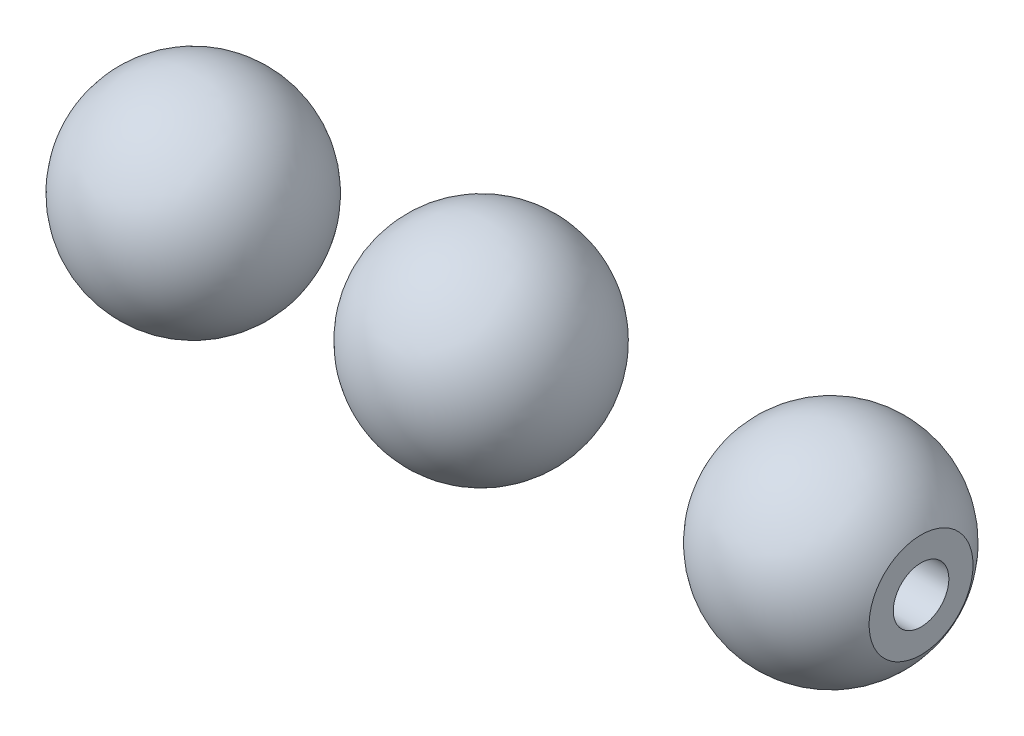
ISO-10303-21;
HEADER;
FILE_DESCRIPTION(('STEP AP214'),'2;1');
FILE_NAME('part.step','',(''),(''),'','','');
FILE_SCHEMA(('AUTOMOTIVE_DESIGN { 1 0 10303 214 1 1 1 1 }'));
ENDSEC;
DATA;
#1=APPLICATION_CONTEXT('core data for automotive mechanical design processes');
#2=APPLICATION_PROTOCOL_DEFINITION('international standard','automotive_design',2000,#1);
#3=PRODUCT_CONTEXT('',#1,'mechanical');
#4=PRODUCT('Part','Part','',(#3));
#5=PRODUCT_RELATED_PRODUCT_CATEGORY('part','',(#4));
#6=PRODUCT_DEFINITION_FORMATION('','',#4);
#7=PRODUCT_DEFINITION_CONTEXT('part definition',#1,'design');
#8=PRODUCT_DEFINITION('design','',#6,#7);
#9=PRODUCT_DEFINITION_SHAPE('','',#8);
#10=(LENGTH_UNIT() NAMED_UNIT(*) SI_UNIT(.MILLI.,.METRE.));
#11=(NAMED_UNIT(*) PLANE_ANGLE_UNIT() SI_UNIT($,.RADIAN.));
#12=(NAMED_UNIT(*) SI_UNIT($,.STERADIAN.) SOLID_ANGLE_UNIT());
#13=UNCERTAINTY_MEASURE_WITH_UNIT(LENGTH_MEASURE(1.E-05),#10,'distance_accuracy_value','');
#14=(GEOMETRIC_REPRESENTATION_CONTEXT(3) GLOBAL_UNCERTAINTY_ASSIGNED_CONTEXT((#13)) GLOBAL_UNIT_ASSIGNED_CONTEXT((#10,
#11,#12)) REPRESENTATION_CONTEXT('',''));
#15=CARTESIAN_POINT('',(0.,0.,0.));
#16=DIRECTION('',(0.,0.,1.));
#17=DIRECTION('',(1.,0.,0.));
#18=AXIS2_PLACEMENT_3D('',#15,#16,#17);
#19=CARTESIAN_POINT('',(95.0241035407147,0.,0.));
#20=DIRECTION('',(-1.,0.,0.));
#21=DIRECTION('',(0.,0.,1.));
#22=AXIS2_PLACEMENT_3D('',#19,#20,#21);
#23=PLANE('',#22);
#24=CARTESIAN_POINT('',(95.0241035407147,0.,0.));
#25=DIRECTION('',(1.,0.,0.));
#26=DIRECTION('',(0.,0.,-1.));
#27=AXIS2_PLACEMENT_3D('',#24,#25,#26);
#28=CIRCLE('',#27,6.);
#29=CARTESIAN_POINT('',(95.0241035407147,0.,-6.));
#30=VERTEX_POINT('',#29);
#31=EDGE_CURVE('E61',#30,#30,#28,.T.);
#32=ORIENTED_EDGE('',*,*,#31,.F.);
#33=EDGE_LOOP('',(#32));
#34=FACE_BOUND('',#33,.T.);
#35=CARTESIAN_POINT('',(95.0241035407147,0.,0.));
#36=DIRECTION('',(1.,0.,0.));
#37=DIRECTION('',(0.,0.,-1.));
#38=AXIS2_PLACEMENT_3D('',#35,#36,#37);
#39=CIRCLE('',#38,11.2249721603218);
#40=CARTESIAN_POINT('',(95.0241035407147,0.,-11.2249721603218));
#41=VERTEX_POINT('',#40);
#42=EDGE_CURVE('E12',#41,#41,#39,.T.);
#43=ORIENTED_EDGE('',*,*,#42,.T.);
#44=EDGE_LOOP('',(#43));
#45=FACE_BOUND('',#44,.T.);
#46=ADVANCED_FACE('F43',(#34,#45),#23,.F.);
#47=CARTESIAN_POINT('',(75.5241035407147,0.,0.));
#48=DIRECTION('',(1.,0.,0.));
#49=DIRECTION('',(0.,-1.,0.));
#50=AXIS2_PLACEMENT_3D('',#47,#48,#49);
#51=SPHERICAL_SURFACE('',#50,22.5);
#52=ORIENTED_EDGE('',*,*,#42,.F.);
#53=EDGE_LOOP('',(#52));
#54=FACE_BOUND('',#53,.T.);
#55=ADVANCED_FACE('F56',(#54),#51,.T.);
#56=CARTESIAN_POINT('',(61.0241035407147,0.,0.));
#57=DIRECTION('',(1.,0.,0.));
#58=DIRECTION('',(0.,0.,-1.));
#59=AXIS2_PLACEMENT_3D('',#56,#57,#58);
#60=CONICAL_SURFACE('',#59,5.99999999999999,1.02974425867665);
#61=CARTESIAN_POINT('',(57.4189398265493,0.,0.));
#62=VERTEX_POINT('',#61);
#63=VERTEX_LOOP('',#62);
#64=FACE_BOUND('',#63,.T.);
#65=CARTESIAN_POINT('',(61.0241035407147,0.,0.));
#66=DIRECTION('',(1.,0.,0.));
#67=DIRECTION('',(0.,0.,-1.));
#68=AXIS2_PLACEMENT_3D('',#65,#66,#67);
#69=CIRCLE('',#68,5.99999999999999);
#70=CARTESIAN_POINT('',(61.0241035407147,0.,-5.99999999999999));
#71=VERTEX_POINT('',#70);
#72=EDGE_CURVE('E49',#71,#71,#69,.T.);
#73=ORIENTED_EDGE('',*,*,#72,.T.);
#74=EDGE_LOOP('',(#73));
#75=FACE_BOUND('',#74,.T.);
#76=ADVANCED_FACE('F52',(#64,#75),#60,.F.);
#77=CARTESIAN_POINT('',(95.0241035407147,0.,0.));
#78=DIRECTION('',(1.,0.,0.));
#79=DIRECTION('',(0.,0.,-1.));
#80=AXIS2_PLACEMENT_3D('',#77,#78,#79);
#81=CYLINDRICAL_SURFACE('',#80,5.99999999999999);
#82=ORIENTED_EDGE('',*,*,#72,.F.);
#83=EDGE_LOOP('',(#82));
#84=FACE_BOUND('',#83,.T.);
#85=ORIENTED_EDGE('',*,*,#31,.T.);
#86=EDGE_LOOP('',(#85));
#87=FACE_BOUND('',#86,.T.);
#88=ADVANCED_FACE('F55',(#84,#87),#81,.F.);
#89=CLOSED_SHELL('',(#46,#55,#76,#88));
#90=MANIFOLD_SOLID_BREP('B2',#89);
#91=CARTESIAN_POINT('',(-81.6746595388299,7.73391560156635,0.));
#92=DIRECTION('',(1.,0.,0.));
#93=DIRECTION('',(0.,0.,-1.));
#94=AXIS2_PLACEMENT_3D('',#91,#92,#93);
#95=PLANE('',#94);
#96=CARTESIAN_POINT('',(-81.6746595388299,-3.49105655875548,0.));
#97=DIRECTION('',(-1.,0.,0.));
#98=DIRECTION('',(0.,0.,1.));
#99=AXIS2_PLACEMENT_3D('',#96,#97,#98);
#100=CIRCLE('',#99,10.);
#101=CARTESIAN_POINT('',(-81.6746595388299,-3.49105655875548,10.));
#102=VERTEX_POINT('',#101);
#103=EDGE_CURVE('E134',#102,#102,#100,.T.);
#104=ORIENTED_EDGE('',*,*,#103,.F.);
#105=EDGE_LOOP('',(#104));
#106=FACE_BOUND('',#105,.T.);
#107=CARTESIAN_POINT('',(-81.6746595388299,-3.49105655875548,0.));
#108=DIRECTION('',(-1.,0.,0.));
#109=DIRECTION('',(0.,0.,1.));
#110=AXIS2_PLACEMENT_3D('',#107,#108,#109);
#111=CIRCLE('',#110,11.2249721603218);
#112=CARTESIAN_POINT('',(-81.6746595388299,-3.49105655875548,11.2249721603218));
#113=VERTEX_POINT('',#112);
#114=EDGE_CURVE('E41',#113,#113,#111,.T.);
#115=ORIENTED_EDGE('',*,*,#114,.T.);
#116=EDGE_LOOP('',(#115));
#117=FACE_BOUND('',#116,.T.);
#118=ADVANCED_FACE('F109',(#106,#117),#95,.F.);
#119=CARTESIAN_POINT('',(-62.1746595388299,-3.49105655875548,0.));
#120=DIRECTION('',(-1.,0.,0.));
#121=DIRECTION('',(0.,1.,0.));
#122=AXIS2_PLACEMENT_3D('',#119,#120,#121);
#123=SPHERICAL_SURFACE('',#122,22.5);
#124=ORIENTED_EDGE('',*,*,#114,.F.);
#125=EDGE_LOOP('',(#124));
#126=FACE_BOUND('',#125,.T.);
#127=ADVANCED_FACE('F122',(#126),#123,.T.);
#128=CARTESIAN_POINT('',(-49.6746595388299,-3.49105655875548,0.));
#129=DIRECTION('',(-1.,0.,0.));
#130=DIRECTION('',(0.,0.,1.));
#131=AXIS2_PLACEMENT_3D('',#128,#129,#130);
#132=CONICAL_SURFACE('',#131,5.99999999999999,1.02974425867665);
#133=CARTESIAN_POINT('',(-46.0694958246645,-3.49105655875549,0.));
#134=VERTEX_POINT('',#133);
#135=VERTEX_LOOP('',#134);
#136=FACE_BOUND('',#135,.T.);
#137=CARTESIAN_POINT('',(-49.6746595388299,-3.49105655875548,0.));
#138=DIRECTION('',(-1.,0.,0.));
#139=DIRECTION('',(0.,0.,1.));
#140=AXIS2_PLACEMENT_3D('',#137,#138,#139);
#141=CIRCLE('',#140,5.99999999999999);
#142=CARTESIAN_POINT('',(-49.6746595388299,-3.49105655875548,5.99999999999999));
#143=VERTEX_POINT('',#142);
#144=EDGE_CURVE('E115',#143,#143,#141,.T.);
#145=ORIENTED_EDGE('',*,*,#144,.T.);
#146=EDGE_LOOP('',(#145));
#147=FACE_BOUND('',#146,.T.);
#148=ADVANCED_FACE('F118',(#136,#147),#132,.F.);
#149=CARTESIAN_POINT('',(-81.6746595388299,-3.49105655875548,0.));
#150=DIRECTION('',(-1.,0.,0.));
#151=DIRECTION('',(0.,0.,1.));
#152=AXIS2_PLACEMENT_3D('',#149,#150,#151);
#153=CYLINDRICAL_SURFACE('',#152,5.99999999999999);
#154=ORIENTED_EDGE('',*,*,#144,.F.);
#155=EDGE_LOOP('',(#154));
#156=FACE_BOUND('',#155,.T.);
#157=CARTESIAN_POINT('',(-73.6746595388299,-3.49105655875548,0.));
#158=DIRECTION('',(-1.,0.,0.));
#159=DIRECTION('',(0.,0.,1.));
#160=AXIS2_PLACEMENT_3D('',#157,#158,#159);
#161=CIRCLE('',#160,5.99999999999999);
#162=CARTESIAN_POINT('',(-73.6746595388299,-3.49105655875548,5.99999999999999));
#163=VERTEX_POINT('',#162);
#164=EDGE_CURVE('E127',#163,#163,#161,.T.);
#165=ORIENTED_EDGE('',*,*,#164,.T.);
#166=EDGE_LOOP('',(#165));
#167=FACE_BOUND('',#166,.T.);
#168=ADVANCED_FACE('F121',(#156,#167),#153,.F.);
#169=CARTESIAN_POINT('',(-73.6746595388299,2.50894344124451,0.));
#170=DIRECTION('',(1.,0.,0.));
#171=DIRECTION('',(0.,0.,-1.));
#172=AXIS2_PLACEMENT_3D('',#169,#170,#171);
#173=PLANE('',#172);
#174=ORIENTED_EDGE('',*,*,#164,.F.);
#175=EDGE_LOOP('',(#174));
#176=FACE_BOUND('',#175,.T.);
#177=CARTESIAN_POINT('',(-73.6746595388299,-3.49105655875548,0.));
#178=DIRECTION('',(-1.,0.,0.));
#179=DIRECTION('',(0.,0.,1.));
#180=AXIS2_PLACEMENT_3D('',#177,#178,#179);
#181=CIRCLE('',#180,10.);
#182=CARTESIAN_POINT('',(-73.6746595388299,-3.49105655875548,10.));
#183=VERTEX_POINT('',#182);
#184=EDGE_CURVE('E129',#183,#183,#181,.T.);
#185=ORIENTED_EDGE('',*,*,#184,.T.);
#186=EDGE_LOOP('',(#185));
#187=FACE_BOUND('',#186,.T.);
#188=ADVANCED_FACE('F151',(#176,#187),#173,.F.);
#189=CARTESIAN_POINT('',(-81.6746595388299,-3.49105655875548,0.));
#190=DIRECTION('',(-1.,0.,0.));
#191=DIRECTION('',(0.,0.,1.));
#192=AXIS2_PLACEMENT_3D('',#189,#190,#191);
#193=CYLINDRICAL_SURFACE('',#192,10.);
#194=ORIENTED_EDGE('',*,*,#184,.F.);
#195=EDGE_LOOP('',(#194));
#196=FACE_BOUND('',#195,.T.);
#197=ORIENTED_EDGE('',*,*,#103,.T.);
#198=EDGE_LOOP('',(#197));
#199=FACE_BOUND('',#198,.T.);
#200=ADVANCED_FACE('F138',(#196,#199),#193,.F.);
#201=CLOSED_SHELL('',(#118,#127,#148,#168,#188,#200));
#202=MANIFOLD_SOLID_BREP('B6',#201);
#203=CARTESIAN_POINT('',(0.,0.,-19.5));
#204=DIRECTION('',(0.,0.,1.));
#205=DIRECTION('',(1.,0.,0.));
#206=AXIS2_PLACEMENT_3D('',#203,#204,#205);
#207=PLANE('',#206);
#208=CARTESIAN_POINT('',(0.,0.,-19.5));
#209=DIRECTION('',(0.,0.,-1.));
#210=DIRECTION('',(-1.,0.,0.));
#211=AXIS2_PLACEMENT_3D('',#208,#209,#210);
#212=CIRCLE('',#211,10.);
#213=CARTESIAN_POINT('',(-10.,0.,-19.5));
#214=VERTEX_POINT('',#213);
#215=EDGE_CURVE('E216',#214,#214,#212,.T.);
#216=ORIENTED_EDGE('',*,*,#215,.F.);
#217=EDGE_LOOP('',(#216));
#218=FACE_BOUND('',#217,.T.);
#219=CARTESIAN_POINT('',(0.,0.,-19.5));
#220=DIRECTION('',(0.,0.,-1.));
#221=DIRECTION('',(-1.,0.,0.));
#222=AXIS2_PLACEMENT_3D('',#219,#220,#221);
#223=CIRCLE('',#222,11.2249721603218);
#224=CARTESIAN_POINT('',(-11.2249721603218,0.,-19.5));
#225=VERTEX_POINT('',#224);
#226=EDGE_CURVE('E107',#225,#225,#223,.T.);
#227=ORIENTED_EDGE('',*,*,#226,.T.);
#228=EDGE_LOOP('',(#227));
#229=FACE_BOUND('',#228,.T.);
#230=ADVANCED_FACE('F196',(#218,#229),#207,.F.);
#231=CARTESIAN_POINT('',(0.,0.,0.));
#232=DIRECTION('',(0.,0.,-1.));
#233=DIRECTION('',(0.,-1.,0.));
#234=AXIS2_PLACEMENT_3D('',#231,#232,#233);
#235=SPHERICAL_SURFACE('',#234,22.5);
#236=ORIENTED_EDGE('',*,*,#226,.F.);
#237=EDGE_LOOP('',(#236));
#238=FACE_BOUND('',#237,.T.);
#239=ADVANCED_FACE('F209',(#238),#235,.T.);
#240=CARTESIAN_POINT('',(0.,0.,14.5));
#241=DIRECTION('',(0.,0.,-1.));
#242=DIRECTION('',(-1.,0.,0.));
#243=AXIS2_PLACEMENT_3D('',#240,#241,#242);
#244=CONICAL_SURFACE('',#243,5.99999999999999,1.02974425867665);
#245=CARTESIAN_POINT('',(0.,0.,18.1051637141654));
#246=VERTEX_POINT('',#245);
#247=VERTEX_LOOP('',#246);
#248=FACE_BOUND('',#247,.T.);
#249=CARTESIAN_POINT('',(0.,0.,14.5));
#250=DIRECTION('',(0.,0.,-1.));
#251=DIRECTION('',(-1.,0.,0.));
#252=AXIS2_PLACEMENT_3D('',#249,#250,#251);
#253=CIRCLE('',#252,5.99999999999999);
#254=CARTESIAN_POINT('',(-5.99999999999999,0.,14.5));
#255=VERTEX_POINT('',#254);
#256=EDGE_CURVE('E202',#255,#255,#253,.T.);
#257=ORIENTED_EDGE('',*,*,#256,.T.);
#258=EDGE_LOOP('',(#257));
#259=FACE_BOUND('',#258,.T.);
#260=ADVANCED_FACE('F205',(#248,#259),#244,.F.);
#261=CARTESIAN_POINT('',(0.,0.,-19.5));
#262=DIRECTION('',(0.,0.,-1.));
#263=DIRECTION('',(-1.,0.,0.));
#264=AXIS2_PLACEMENT_3D('',#261,#262,#263);
#265=CYLINDRICAL_SURFACE('',#264,5.99999999999999);
#266=ORIENTED_EDGE('',*,*,#256,.F.);
#267=EDGE_LOOP('',(#266));
#268=FACE_BOUND('',#267,.T.);
#269=CARTESIAN_POINT('',(0.,0.,-15.5));
#270=DIRECTION('',(0.,0.,-1.));
#271=DIRECTION('',(-1.,0.,0.));
#272=AXIS2_PLACEMENT_3D('',#269,#270,#271);
#273=CIRCLE('',#272,6.);
#274=CARTESIAN_POINT('',(-6.,0.,-15.5));
#275=VERTEX_POINT('',#274);
#276=EDGE_CURVE('E214',#275,#275,#273,.T.);
#277=ORIENTED_EDGE('',*,*,#276,.T.);
#278=EDGE_LOOP('',(#277));
#279=FACE_BOUND('',#278,.T.);
#280=ADVANCED_FACE('F208',(#268,#279),#265,.F.);
#281=CARTESIAN_POINT('',(0.,0.,-19.5));
#282=DIRECTION('',(0.,0.,-1.));
#283=DIRECTION('',(-1.,0.,0.));
#284=AXIS2_PLACEMENT_3D('',#281,#282,#283);
#285=CONICAL_SURFACE('',#284,10.,0.785398163397449);
#286=ORIENTED_EDGE('',*,*,#276,.F.);
#287=EDGE_LOOP('',(#286));
#288=FACE_BOUND('',#287,.T.);
#289=ORIENTED_EDGE('',*,*,#215,.T.);
#290=EDGE_LOOP('',(#289));
#291=FACE_BOUND('',#290,.T.);
#292=ADVANCED_FACE('F222',(#288,#291),#285,.F.);
#293=CLOSED_SHELL('',(#230,#239,#260,#280,#292));
#294=MANIFOLD_SOLID_BREP('B35',#293);
#295=ADVANCED_BREP_SHAPE_REPRESENTATION('',(#18,#90,#202,#294),#14);
#296=SHAPE_DEFINITION_REPRESENTATION(#9,#295);
ENDSEC;
END-ISO-10303-21;
